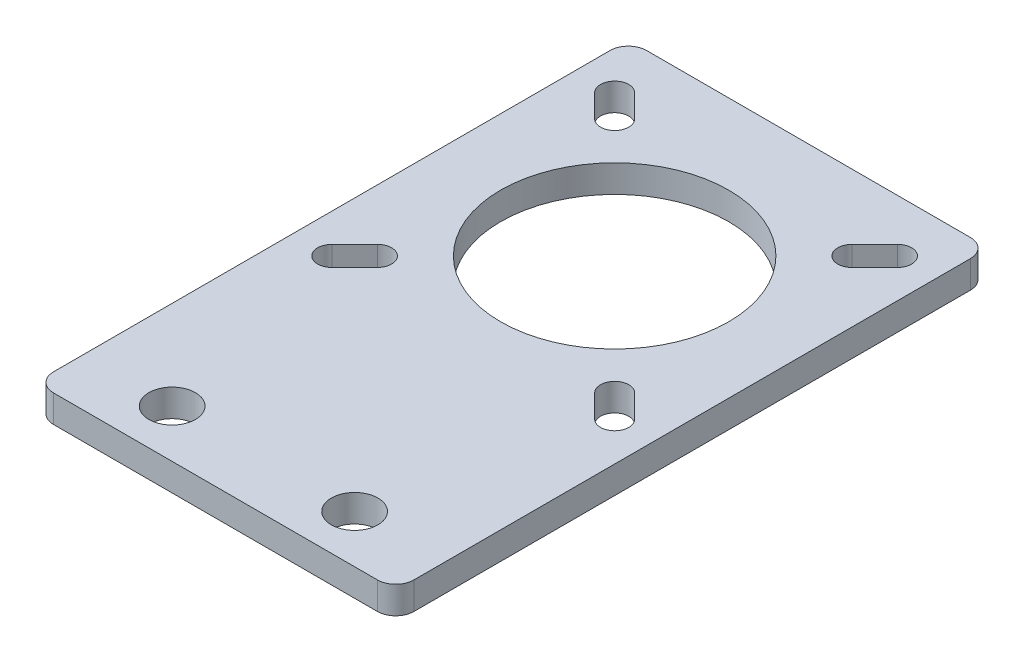
ISO-10303-21;
HEADER;
FILE_DESCRIPTION(('STEP AP214'),'2;1');
FILE_NAME('part.step','',(''),(''),'','','');
FILE_SCHEMA(('AUTOMOTIVE_DESIGN { 1 0 10303 214 1 1 1 1 }'));
ENDSEC;
DATA;
#1=APPLICATION_CONTEXT('core data for automotive mechanical design processes');
#2=APPLICATION_PROTOCOL_DEFINITION('international standard','automotive_design',2000,#1);
#3=PRODUCT_CONTEXT('',#1,'mechanical');
#4=PRODUCT('Part','Part','',(#3));
#5=PRODUCT_RELATED_PRODUCT_CATEGORY('part','',(#4));
#6=PRODUCT_DEFINITION_FORMATION('','',#4);
#7=PRODUCT_DEFINITION_CONTEXT('part definition',#1,'design');
#8=PRODUCT_DEFINITION('design','',#6,#7);
#9=PRODUCT_DEFINITION_SHAPE('','',#8);
#10=(LENGTH_UNIT() NAMED_UNIT(*) SI_UNIT(.MILLI.,.METRE.));
#11=(NAMED_UNIT(*) PLANE_ANGLE_UNIT() SI_UNIT($,.RADIAN.));
#12=(NAMED_UNIT(*) SI_UNIT($,.STERADIAN.) SOLID_ANGLE_UNIT());
#13=UNCERTAINTY_MEASURE_WITH_UNIT(LENGTH_MEASURE(1.E-05),#10,'distance_accuracy_value','');
#14=(GEOMETRIC_REPRESENTATION_CONTEXT(3) GLOBAL_UNCERTAINTY_ASSIGNED_CONTEXT((#13)) GLOBAL_UNIT_ASSIGNED_CONTEXT((#10,
#11,#12)) REPRESENTATION_CONTEXT('',''));
#15=CARTESIAN_POINT('',(0.,0.,0.));
#16=DIRECTION('',(0.,0.,1.));
#17=DIRECTION('',(1.,0.,0.));
#18=AXIS2_PLACEMENT_3D('',#15,#16,#17);
#19=CARTESIAN_POINT('',(-17.75,3.,41.75));
#20=DIRECTION('',(0.,-1.,0.));
#21=DIRECTION('',(0.,0.,-1.));
#22=AXIS2_PLACEMENT_3D('',#19,#20,#21);
#23=PLANE('',#22);
#24=CARTESIAN_POINT('',(-12.9999999999999,3.,13.));
#25=DIRECTION('',(0.,1.,0.));
#26=DIRECTION('',(0.,0.,1.));
#27=AXIS2_PLACEMENT_3D('',#24,#25,#26);
#28=CIRCLE('',#27,1.55);
#29=CARTESIAN_POINT('',(-11.9039844891608,3.,14.0960155108391));
#30=VERTEX_POINT('',#29);
#31=CARTESIAN_POINT('',(-14.0960155108391,3.,11.9039844891609));
#32=VERTEX_POINT('',#31);
#33=EDGE_CURVE('E229',#30,#32,#28,.T.);
#34=ORIENTED_EDGE('',*,*,#33,.F.);
#35=DIRECTION('',(0.707106781186545,0.,-0.70710678118655));
#36=VECTOR('',#35,1.);
#37=CARTESIAN_POINT('',(-11.9039844891608,3.,14.0960155108391));
#38=LINE('',#37,#36);
#39=CARTESIAN_POINT('',(-14.4039844891608,3.,16.5960155108391));
#40=VERTEX_POINT('',#39);
#41=EDGE_CURVE('E237',#40,#30,#38,.T.);
#42=ORIENTED_EDGE('',*,*,#41,.F.);
#43=CARTESIAN_POINT('',(-15.4999999999999,3.,15.5));
#44=DIRECTION('',(0.,1.,0.));
#45=DIRECTION('',(0.,0.,1.));
#46=AXIS2_PLACEMENT_3D('',#43,#44,#45);
#47=CIRCLE('',#46,1.55);
#48=CARTESIAN_POINT('',(-16.5960155108391,3.,14.4039844891608));
#49=VERTEX_POINT('',#48);
#50=EDGE_CURVE('E234',#49,#40,#47,.T.);
#51=ORIENTED_EDGE('',*,*,#50,.F.);
#52=DIRECTION('',(-0.707106781186545,0.,0.70710678118655));
#53=VECTOR('',#52,1.);
#54=CARTESIAN_POINT('',(-14.0960155108391,3.,11.9039844891609));
#55=LINE('',#54,#53);
#56=EDGE_CURVE('E231',#32,#49,#55,.T.);
#57=ORIENTED_EDGE('',*,*,#56,.F.);
#58=EDGE_LOOP('',(#34,#42,#51,#57));
#59=FACE_BOUND('',#58,.T.);
#60=CARTESIAN_POINT('',(-9.99999999999997,3.,38.5));
#61=DIRECTION('',(0.,1.,0.));
#62=DIRECTION('',(0.,0.,1.));
#63=AXIS2_PLACEMENT_3D('',#60,#61,#62);
#64=CIRCLE('',#63,2.55);
#65=CARTESIAN_POINT('',(-9.99999999999997,3.,41.05));
#66=VERTEX_POINT('',#65);
#67=EDGE_CURVE('E291',#66,#66,#64,.T.);
#68=ORIENTED_EDGE('',*,*,#67,.F.);
#69=EDGE_LOOP('',(#68));
#70=FACE_BOUND('',#69,.T.);
#71=CARTESIAN_POINT('',(10.,3.,38.5));
#72=DIRECTION('',(0.,1.,0.));
#73=DIRECTION('',(0.,0.,1.));
#74=AXIS2_PLACEMENT_3D('',#71,#72,#73);
#75=CIRCLE('',#74,2.55);
#76=CARTESIAN_POINT('',(10.,3.,41.05));
#77=VERTEX_POINT('',#76);
#78=EDGE_CURVE('E297',#77,#77,#75,.T.);
#79=ORIENTED_EDGE('',*,*,#78,.F.);
#80=EDGE_LOOP('',(#79));
#81=FACE_BOUND('',#80,.T.);
#82=CARTESIAN_POINT('',(12.9999999999999,3.,-13.));
#83=DIRECTION('',(0.,1.,0.));
#84=DIRECTION('',(0.,0.,1.));
#85=AXIS2_PLACEMENT_3D('',#82,#83,#84);
#86=CIRCLE('',#85,1.55);
#87=CARTESIAN_POINT('',(11.9039844891608,3.,-14.0960155108391));
#88=VERTEX_POINT('',#87);
#89=CARTESIAN_POINT('',(14.0960155108391,3.,-11.9039844891608));
#90=VERTEX_POINT('',#89);
#91=EDGE_CURVE('E303',#88,#90,#86,.T.);
#92=ORIENTED_EDGE('',*,*,#91,.F.);
#93=DIRECTION('',(-0.707106781186545,0.,0.70710678118655));
#94=VECTOR('',#93,1.);
#95=CARTESIAN_POINT('',(11.9039844891608,3.,-14.0960155108391));
#96=LINE('',#95,#94);
#97=CARTESIAN_POINT('',(14.4039844891608,3.,-16.5960155108391));
#98=VERTEX_POINT('',#97);
#99=EDGE_CURVE('E311',#98,#88,#96,.T.);
#100=ORIENTED_EDGE('',*,*,#99,.F.);
#101=CARTESIAN_POINT('',(15.4999999999999,3.,-15.5));
#102=DIRECTION('',(0.,1.,0.));
#103=DIRECTION('',(0.,0.,1.));
#104=AXIS2_PLACEMENT_3D('',#101,#102,#103);
#105=CIRCLE('',#104,1.55);
#106=CARTESIAN_POINT('',(16.5960155108391,3.,-14.4039844891608));
#107=VERTEX_POINT('',#106);
#108=EDGE_CURVE('E308',#107,#98,#105,.T.);
#109=ORIENTED_EDGE('',*,*,#108,.F.);
#110=DIRECTION('',(0.707106781186546,0.,-0.707106781186549));
#111=VECTOR('',#110,1.);
#112=CARTESIAN_POINT('',(14.0960155108391,3.,-11.9039844891608));
#113=LINE('',#112,#111);
#114=EDGE_CURVE('E305',#90,#107,#113,.T.);
#115=ORIENTED_EDGE('',*,*,#114,.F.);
#116=EDGE_LOOP('',(#92,#100,#109,#115));
#117=FACE_BOUND('',#116,.T.);
#118=CARTESIAN_POINT('',(-17.75,3.,41.75));
#119=DIRECTION('',(0.,1.,0.));
#120=DIRECTION('',(0.,0.,-1.));
#121=AXIS2_PLACEMENT_3D('',#118,#119,#120);
#122=CIRCLE('',#121,2.);
#123=CARTESIAN_POINT('',(-19.75,3.,41.75));
#124=VERTEX_POINT('',#123);
#125=CARTESIAN_POINT('',(-17.75,3.,43.75));
#126=VERTEX_POINT('',#125);
#127=EDGE_CURVE('E340',#124,#126,#122,.T.);
#128=ORIENTED_EDGE('',*,*,#127,.T.);
#129=DIRECTION('',(1.,0.,0.));
#130=VECTOR('',#129,1.);
#131=CARTESIAN_POINT('',(17.75,3.,43.75));
#132=LINE('',#131,#130);
#133=CARTESIAN_POINT('',(17.75,3.,43.75));
#134=VERTEX_POINT('',#133);
#135=EDGE_CURVE('E343',#126,#134,#132,.T.);
#136=ORIENTED_EDGE('',*,*,#135,.T.);
#137=CARTESIAN_POINT('',(17.75,3.,41.75));
#138=DIRECTION('',(0.,1.,0.));
#139=DIRECTION('',(0.,0.,1.));
#140=AXIS2_PLACEMENT_3D('',#137,#138,#139);
#141=CIRCLE('',#140,2.);
#142=CARTESIAN_POINT('',(19.75,3.,41.75));
#143=VERTEX_POINT('',#142);
#144=EDGE_CURVE('E346',#134,#143,#141,.T.);
#145=ORIENTED_EDGE('',*,*,#144,.T.);
#146=DIRECTION('',(0.,0.,-1.));
#147=VECTOR('',#146,1.);
#148=CARTESIAN_POINT('',(19.75,3.,41.75));
#149=LINE('',#148,#147);
#150=CARTESIAN_POINT('',(19.75,3.,-19.25));
#151=VERTEX_POINT('',#150);
#152=EDGE_CURVE('E348',#143,#151,#149,.T.);
#153=ORIENTED_EDGE('',*,*,#152,.T.);
#154=CARTESIAN_POINT('',(17.75,3.,-19.25));
#155=DIRECTION('',(0.,1.,0.));
#156=DIRECTION('',(0.,0.,1.));
#157=AXIS2_PLACEMENT_3D('',#154,#155,#156);
#158=CIRCLE('',#157,1.99999999999999);
#159=CARTESIAN_POINT('',(17.75,3.,-21.25));
#160=VERTEX_POINT('',#159);
#161=EDGE_CURVE('E350',#151,#160,#158,.T.);
#162=ORIENTED_EDGE('',*,*,#161,.T.);
#163=DIRECTION('',(-1.,0.,0.));
#164=VECTOR('',#163,1.);
#165=CARTESIAN_POINT('',(17.75,3.,-21.25));
#166=LINE('',#165,#164);
#167=CARTESIAN_POINT('',(-17.75,3.,-21.25));
#168=VERTEX_POINT('',#167);
#169=EDGE_CURVE('E352',#160,#168,#166,.T.);
#170=ORIENTED_EDGE('',*,*,#169,.T.);
#171=CARTESIAN_POINT('',(-17.75,3.,-19.25));
#172=DIRECTION('',(0.,1.,0.));
#173=DIRECTION('',(0.,0.,1.));
#174=AXIS2_PLACEMENT_3D('',#171,#172,#173);
#175=CIRCLE('',#174,1.99999999999999);
#176=CARTESIAN_POINT('',(-19.75,3.,-19.25));
#177=VERTEX_POINT('',#176);
#178=EDGE_CURVE('E354',#168,#177,#175,.T.);
#179=ORIENTED_EDGE('',*,*,#178,.T.);
#180=DIRECTION('',(0.,0.,1.));
#181=VECTOR('',#180,1.);
#182=CARTESIAN_POINT('',(-19.75,3.,41.75));
#183=LINE('',#182,#181);
#184=EDGE_CURVE('E356',#177,#124,#183,.T.);
#185=ORIENTED_EDGE('',*,*,#184,.T.);
#186=EDGE_LOOP('',(#128,#136,#145,#153,#162,#170,#179,#185));
#187=FACE_BOUND('',#186,.T.);
#188=CARTESIAN_POINT('',(0.,3.,0.));
#189=DIRECTION('',(0.,1.,0.));
#190=DIRECTION('',(0.,0.,1.));
#191=AXIS2_PLACEMENT_3D('',#188,#189,#190);
#192=CIRCLE('',#191,12.5);
#193=CARTESIAN_POINT('',(0.,3.,12.5));
#194=VERTEX_POINT('',#193);
#195=EDGE_CURVE('E334',#194,#194,#192,.T.);
#196=ORIENTED_EDGE('',*,*,#195,.F.);
#197=EDGE_LOOP('',(#196));
#198=FACE_BOUND('',#197,.T.);
#199=CARTESIAN_POINT('',(-12.9999999999999,3.,-13.));
#200=DIRECTION('',(0.,1.,0.));
#201=DIRECTION('',(0.,0.,-1.));
#202=AXIS2_PLACEMENT_3D('',#199,#200,#201);
#203=CIRCLE('',#202,1.55);
#204=CARTESIAN_POINT('',(-14.0960155108391,3.,-11.9039844891609));
#205=VERTEX_POINT('',#204);
#206=CARTESIAN_POINT('',(-11.9039844891608,3.,-14.0960155108391));
#207=VERTEX_POINT('',#206);
#208=EDGE_CURVE('E260',#205,#207,#203,.T.);
#209=ORIENTED_EDGE('',*,*,#208,.F.);
#210=DIRECTION('',(0.707106781186545,0.,0.70710678118655));
#211=VECTOR('',#210,1.);
#212=CARTESIAN_POINT('',(-14.0960155108391,3.,-11.9039844891609));
#213=LINE('',#212,#211);
#214=CARTESIAN_POINT('',(-16.5960155108391,3.,-14.4039844891609));
#215=VERTEX_POINT('',#214);
#216=EDGE_CURVE('E268',#215,#205,#213,.T.);
#217=ORIENTED_EDGE('',*,*,#216,.F.);
#218=CARTESIAN_POINT('',(-15.4999999999999,3.,-15.5));
#219=DIRECTION('',(0.,1.,0.));
#220=DIRECTION('',(0.,0.,-1.));
#221=AXIS2_PLACEMENT_3D('',#218,#219,#220);
#222=CIRCLE('',#221,1.55);
#223=CARTESIAN_POINT('',(-14.4039844891608,3.,-16.5960155108391));
#224=VERTEX_POINT('',#223);
#225=EDGE_CURVE('E265',#224,#215,#222,.T.);
#226=ORIENTED_EDGE('',*,*,#225,.F.);
#227=DIRECTION('',(-0.707106781186545,0.,-0.70710678118655));
#228=VECTOR('',#227,1.);
#229=CARTESIAN_POINT('',(-11.9039844891608,3.,-14.0960155108391));
#230=LINE('',#229,#228);
#231=EDGE_CURVE('E262',#207,#224,#230,.T.);
#232=ORIENTED_EDGE('',*,*,#231,.F.);
#233=EDGE_LOOP('',(#209,#217,#226,#232));
#234=FACE_BOUND('',#233,.T.);
#235=CARTESIAN_POINT('',(12.9999999999999,3.,13.));
#236=DIRECTION('',(0.,1.,0.));
#237=DIRECTION('',(0.,0.,-1.));
#238=AXIS2_PLACEMENT_3D('',#235,#236,#237);
#239=CIRCLE('',#238,1.55);
#240=CARTESIAN_POINT('',(14.0960155108391,3.,11.9039844891608));
#241=VERTEX_POINT('',#240);
#242=CARTESIAN_POINT('',(11.9039844891608,3.,14.0960155108391));
#243=VERTEX_POINT('',#242);
#244=EDGE_CURVE('E193',#241,#243,#239,.T.);
#245=ORIENTED_EDGE('',*,*,#244,.F.);
#246=DIRECTION('',(-0.707106781186546,0.,-0.707106781186549));
#247=VECTOR('',#246,1.);
#248=CARTESIAN_POINT('',(14.0960155108391,3.,11.9039844891608));
#249=LINE('',#248,#247);
#250=CARTESIAN_POINT('',(16.5960155108391,3.,14.4039844891608));
#251=VERTEX_POINT('',#250);
#252=EDGE_CURVE('E215',#251,#241,#249,.T.);
#253=ORIENTED_EDGE('',*,*,#252,.F.);
#254=CARTESIAN_POINT('',(15.4999999999999,3.,15.5));
#255=DIRECTION('',(0.,1.,0.));
#256=DIRECTION('',(0.,0.,-1.));
#257=AXIS2_PLACEMENT_3D('',#254,#255,#256);
#258=CIRCLE('',#257,1.55);
#259=CARTESIAN_POINT('',(14.4039844891608,3.,16.5960155108391));
#260=VERTEX_POINT('',#259);
#261=EDGE_CURVE('E213',#260,#251,#258,.T.);
#262=ORIENTED_EDGE('',*,*,#261,.F.);
#263=DIRECTION('',(0.707106781186545,0.,0.70710678118655));
#264=VECTOR('',#263,1.);
#265=CARTESIAN_POINT('',(11.9039844891608,3.,14.0960155108391));
#266=LINE('',#265,#264);
#267=EDGE_CURVE('E201',#243,#260,#266,.T.);
#268=ORIENTED_EDGE('',*,*,#267,.F.);
#269=EDGE_LOOP('',(#245,#253,#262,#268));
#270=FACE_BOUND('',#269,.T.);
#271=ADVANCED_FACE('F32',(#59,#70,#81,#117,#187,#198,#234,#270),#23,.F.);
#272=CARTESIAN_POINT('',(-17.75,0.,41.75));
#273=DIRECTION('',(0.,-1.,0.));
#274=DIRECTION('',(0.,0.,-1.));
#275=AXIS2_PLACEMENT_3D('',#272,#273,#274);
#276=PLANE('',#275);
#277=CARTESIAN_POINT('',(10.,0.,38.5));
#278=DIRECTION('',(0.,1.,0.));
#279=DIRECTION('',(0.,0.,1.));
#280=AXIS2_PLACEMENT_3D('',#277,#278,#279);
#281=CIRCLE('',#280,2.55);
#282=CARTESIAN_POINT('',(10.,0.,41.05));
#283=VERTEX_POINT('',#282);
#284=EDGE_CURVE('E294',#283,#283,#281,.T.);
#285=ORIENTED_EDGE('',*,*,#284,.T.);
#286=EDGE_LOOP('',(#285));
#287=FACE_BOUND('',#286,.T.);
#288=CARTESIAN_POINT('',(-17.75,0.,41.75));
#289=DIRECTION('',(0.,1.,0.));
#290=DIRECTION('',(0.,0.,-1.));
#291=AXIS2_PLACEMENT_3D('',#288,#289,#290);
#292=CIRCLE('',#291,2.);
#293=CARTESIAN_POINT('',(-19.75,0.,41.75));
#294=VERTEX_POINT('',#293);
#295=CARTESIAN_POINT('',(-17.75,0.,43.75));
#296=VERTEX_POINT('',#295);
#297=EDGE_CURVE('E337',#294,#296,#292,.T.);
#298=ORIENTED_EDGE('',*,*,#297,.F.);
#299=DIRECTION('',(0.,0.,1.));
#300=VECTOR('',#299,1.);
#301=CARTESIAN_POINT('',(-19.75,0.,41.75));
#302=LINE('',#301,#300);
#303=CARTESIAN_POINT('',(-19.75,0.,-19.25));
#304=VERTEX_POINT('',#303);
#305=EDGE_CURVE('E344',#304,#294,#302,.T.);
#306=ORIENTED_EDGE('',*,*,#305,.F.);
#307=CARTESIAN_POINT('',(-17.75,0.,-19.25));
#308=DIRECTION('',(0.,1.,0.));
#309=DIRECTION('',(0.,0.,1.));
#310=AXIS2_PLACEMENT_3D('',#307,#308,#309);
#311=CIRCLE('',#310,1.99999999999999);
#312=CARTESIAN_POINT('',(-17.75,0.,-21.25));
#313=VERTEX_POINT('',#312);
#314=EDGE_CURVE('E371',#313,#304,#311,.T.);
#315=ORIENTED_EDGE('',*,*,#314,.F.);
#316=DIRECTION('',(-1.,0.,0.));
#317=VECTOR('',#316,1.);
#318=CARTESIAN_POINT('',(17.75,0.,-21.25));
#319=LINE('',#318,#317);
#320=CARTESIAN_POINT('',(17.75,0.,-21.25));
#321=VERTEX_POINT('',#320);
#322=EDGE_CURVE('E369',#321,#313,#319,.T.);
#323=ORIENTED_EDGE('',*,*,#322,.F.);
#324=CARTESIAN_POINT('',(17.75,0.,-19.25));
#325=DIRECTION('',(0.,1.,0.));
#326=DIRECTION('',(0.,0.,1.));
#327=AXIS2_PLACEMENT_3D('',#324,#325,#326);
#328=CIRCLE('',#327,1.99999999999999);
#329=CARTESIAN_POINT('',(19.75,0.,-19.25));
#330=VERTEX_POINT('',#329);
#331=EDGE_CURVE('E367',#330,#321,#328,.T.);
#332=ORIENTED_EDGE('',*,*,#331,.F.);
#333=DIRECTION('',(0.,0.,-1.));
#334=VECTOR('',#333,1.);
#335=CARTESIAN_POINT('',(19.75,0.,41.75));
#336=LINE('',#335,#334);
#337=CARTESIAN_POINT('',(19.75,0.,41.75));
#338=VERTEX_POINT('',#337);
#339=EDGE_CURVE('E365',#338,#330,#336,.T.);
#340=ORIENTED_EDGE('',*,*,#339,.F.);
#341=CARTESIAN_POINT('',(17.75,0.,41.75));
#342=DIRECTION('',(0.,1.,0.));
#343=DIRECTION('',(0.,0.,1.));
#344=AXIS2_PLACEMENT_3D('',#341,#342,#343);
#345=CIRCLE('',#344,2.);
#346=CARTESIAN_POINT('',(17.75,0.,43.75));
#347=VERTEX_POINT('',#346);
#348=EDGE_CURVE('E363',#347,#338,#345,.T.);
#349=ORIENTED_EDGE('',*,*,#348,.F.);
#350=DIRECTION('',(1.,0.,0.));
#351=VECTOR('',#350,1.);
#352=CARTESIAN_POINT('',(17.75,0.,43.75));
#353=LINE('',#352,#351);
#354=EDGE_CURVE('E361',#296,#347,#353,.T.);
#355=ORIENTED_EDGE('',*,*,#354,.F.);
#356=EDGE_LOOP('',(#298,#306,#315,#323,#332,#340,#349,#355));
#357=FACE_BOUND('',#356,.T.);
#358=CARTESIAN_POINT('',(0.,0.,0.));
#359=DIRECTION('',(0.,1.,0.));
#360=DIRECTION('',(0.,0.,1.));
#361=AXIS2_PLACEMENT_3D('',#358,#359,#360);
#362=CIRCLE('',#361,12.5);
#363=CARTESIAN_POINT('',(0.,0.,12.5));
#364=VERTEX_POINT('',#363);
#365=EDGE_CURVE('E333',#364,#364,#362,.T.);
#366=ORIENTED_EDGE('',*,*,#365,.T.);
#367=EDGE_LOOP('',(#366));
#368=FACE_BOUND('',#367,.T.);
#369=DIRECTION('',(-0.707106781186545,0.,0.70710678118655));
#370=VECTOR('',#369,1.);
#371=CARTESIAN_POINT('',(11.9039844891608,0.,-14.0960155108391));
#372=LINE('',#371,#370);
#373=CARTESIAN_POINT('',(14.4039844891608,0.,-16.5960155108391));
#374=VERTEX_POINT('',#373);
#375=CARTESIAN_POINT('',(11.9039844891608,0.,-14.0960155108391));
#376=VERTEX_POINT('',#375);
#377=EDGE_CURVE('E306',#374,#376,#372,.T.);
#378=ORIENTED_EDGE('',*,*,#377,.T.);
#379=CARTESIAN_POINT('',(12.9999999999999,0.,-13.));
#380=DIRECTION('',(0.,1.,0.));
#381=DIRECTION('',(0.,0.,1.));
#382=AXIS2_PLACEMENT_3D('',#379,#380,#381);
#383=CIRCLE('',#382,1.55);
#384=CARTESIAN_POINT('',(14.0960155108391,0.,-11.9039844891608));
#385=VERTEX_POINT('',#384);
#386=EDGE_CURVE('E300',#376,#385,#383,.T.);
#387=ORIENTED_EDGE('',*,*,#386,.T.);
#388=DIRECTION('',(0.707106781186546,0.,-0.707106781186549));
#389=VECTOR('',#388,1.);
#390=CARTESIAN_POINT('',(14.0960155108391,0.,-11.9039844891608));
#391=LINE('',#390,#389);
#392=CARTESIAN_POINT('',(16.5960155108391,0.,-14.4039844891608));
#393=VERTEX_POINT('',#392);
#394=EDGE_CURVE('E316',#385,#393,#391,.T.);
#395=ORIENTED_EDGE('',*,*,#394,.T.);
#396=CARTESIAN_POINT('',(15.4999999999999,0.,-15.5));
#397=DIRECTION('',(0.,1.,0.));
#398=DIRECTION('',(0.,0.,1.));
#399=AXIS2_PLACEMENT_3D('',#396,#397,#398);
#400=CIRCLE('',#399,1.55);
#401=EDGE_CURVE('E319',#393,#374,#400,.T.);
#402=ORIENTED_EDGE('',*,*,#401,.T.);
#403=EDGE_LOOP('',(#378,#387,#395,#402));
#404=FACE_BOUND('',#403,.T.);
#405=CARTESIAN_POINT('',(-9.99999999999997,0.,38.5));
#406=DIRECTION('',(0.,1.,0.));
#407=DIRECTION('',(0.,0.,1.));
#408=AXIS2_PLACEMENT_3D('',#405,#406,#407);
#409=CIRCLE('',#408,2.55);
#410=CARTESIAN_POINT('',(-9.99999999999997,0.,41.05));
#411=VERTEX_POINT('',#410);
#412=EDGE_CURVE('E290',#411,#411,#409,.T.);
#413=ORIENTED_EDGE('',*,*,#412,.T.);
#414=EDGE_LOOP('',(#413));
#415=FACE_BOUND('',#414,.T.);
#416=DIRECTION('',(0.707106781186545,0.,0.70710678118655));
#417=VECTOR('',#416,1.);
#418=CARTESIAN_POINT('',(-14.0960155108391,0.,-11.9039844891609));
#419=LINE('',#418,#417);
#420=CARTESIAN_POINT('',(-16.5960155108391,0.,-14.4039844891608));
#421=VERTEX_POINT('',#420);
#422=CARTESIAN_POINT('',(-14.0960155108391,0.,-11.9039844891609));
#423=VERTEX_POINT('',#422);
#424=EDGE_CURVE('E263',#421,#423,#419,.T.);
#425=ORIENTED_EDGE('',*,*,#424,.T.);
#426=CARTESIAN_POINT('',(-12.9999999999999,0.,-13.));
#427=DIRECTION('',(0.,1.,0.));
#428=DIRECTION('',(0.,0.,-1.));
#429=AXIS2_PLACEMENT_3D('',#426,#427,#428);
#430=CIRCLE('',#429,1.55);
#431=CARTESIAN_POINT('',(-11.9039844891608,0.,-14.0960155108391));
#432=VERTEX_POINT('',#431);
#433=EDGE_CURVE('E259',#423,#432,#430,.T.);
#434=ORIENTED_EDGE('',*,*,#433,.T.);
#435=DIRECTION('',(-0.707106781186545,0.,-0.70710678118655));
#436=VECTOR('',#435,1.);
#437=CARTESIAN_POINT('',(-11.9039844891608,0.,-14.0960155108391));
#438=LINE('',#437,#436);
#439=CARTESIAN_POINT('',(-14.4039844891608,0.,-16.5960155108391));
#440=VERTEX_POINT('',#439);
#441=EDGE_CURVE('E273',#432,#440,#438,.T.);
#442=ORIENTED_EDGE('',*,*,#441,.T.);
#443=CARTESIAN_POINT('',(-15.4999999999999,0.,-15.5));
#444=DIRECTION('',(0.,1.,0.));
#445=DIRECTION('',(0.,0.,-1.));
#446=AXIS2_PLACEMENT_3D('',#443,#444,#445);
#447=CIRCLE('',#446,1.55);
#448=EDGE_CURVE('E276',#440,#421,#447,.T.);
#449=ORIENTED_EDGE('',*,*,#448,.T.);
#450=EDGE_LOOP('',(#425,#434,#442,#449));
#451=FACE_BOUND('',#450,.T.);
#452=DIRECTION('',(0.707106781186545,0.,-0.70710678118655));
#453=VECTOR('',#452,1.);
#454=CARTESIAN_POINT('',(-11.9039844891608,0.,14.0960155108391));
#455=LINE('',#454,#453);
#456=CARTESIAN_POINT('',(-14.4039844891608,0.,16.5960155108391));
#457=VERTEX_POINT('',#456);
#458=CARTESIAN_POINT('',(-11.9039844891608,0.,14.0960155108391));
#459=VERTEX_POINT('',#458);
#460=EDGE_CURVE('E232',#457,#459,#455,.T.);
#461=ORIENTED_EDGE('',*,*,#460,.T.);
#462=CARTESIAN_POINT('',(-12.9999999999999,0.,13.));
#463=DIRECTION('',(0.,1.,0.));
#464=DIRECTION('',(0.,0.,1.));
#465=AXIS2_PLACEMENT_3D('',#462,#463,#464);
#466=CIRCLE('',#465,1.55);
#467=CARTESIAN_POINT('',(-14.0960155108391,0.,11.9039844891609));
#468=VERTEX_POINT('',#467);
#469=EDGE_CURVE('E209',#459,#468,#466,.T.);
#470=ORIENTED_EDGE('',*,*,#469,.T.);
#471=DIRECTION('',(-0.707106781186545,0.,0.70710678118655));
#472=VECTOR('',#471,1.);
#473=CARTESIAN_POINT('',(-14.0960155108391,0.,11.9039844891609));
#474=LINE('',#473,#472);
#475=CARTESIAN_POINT('',(-16.5960155108391,0.,14.4039844891608));
#476=VERTEX_POINT('',#475);
#477=EDGE_CURVE('E242',#468,#476,#474,.T.);
#478=ORIENTED_EDGE('',*,*,#477,.T.);
#479=CARTESIAN_POINT('',(-15.4999999999999,0.,15.5));
#480=DIRECTION('',(0.,1.,0.));
#481=DIRECTION('',(0.,0.,1.));
#482=AXIS2_PLACEMENT_3D('',#479,#480,#481);
#483=CIRCLE('',#482,1.55);
#484=EDGE_CURVE('E245',#476,#457,#483,.T.);
#485=ORIENTED_EDGE('',*,*,#484,.T.);
#486=EDGE_LOOP('',(#461,#470,#478,#485));
#487=FACE_BOUND('',#486,.T.);
#488=DIRECTION('',(-0.707106781186546,0.,-0.707106781186549));
#489=VECTOR('',#488,1.);
#490=CARTESIAN_POINT('',(14.0960155108391,0.,11.9039844891608));
#491=LINE('',#490,#489);
#492=CARTESIAN_POINT('',(16.5960155108391,0.,14.4039844891608));
#493=VERTEX_POINT('',#492);
#494=CARTESIAN_POINT('',(14.0960155108391,0.,11.9039844891609));
#495=VERTEX_POINT('',#494);
#496=EDGE_CURVE('E202',#493,#495,#491,.T.);
#497=ORIENTED_EDGE('',*,*,#496,.T.);
#498=CARTESIAN_POINT('',(12.9999999999999,0.,13.));
#499=DIRECTION('',(0.,1.,0.));
#500=DIRECTION('',(0.,0.,-1.));
#501=AXIS2_PLACEMENT_3D('',#498,#499,#500);
#502=CIRCLE('',#501,1.55);
#503=CARTESIAN_POINT('',(11.9039844891608,0.,14.0960155108391));
#504=VERTEX_POINT('',#503);
#505=EDGE_CURVE('E55',#495,#504,#502,.T.);
#506=ORIENTED_EDGE('',*,*,#505,.T.);
#507=DIRECTION('',(0.707106781186545,0.,0.70710678118655));
#508=VECTOR('',#507,1.);
#509=CARTESIAN_POINT('',(11.9039844891608,0.,14.0960155108391));
#510=LINE('',#509,#508);
#511=CARTESIAN_POINT('',(14.4039844891608,0.,16.5960155108391));
#512=VERTEX_POINT('',#511);
#513=EDGE_CURVE('E208',#504,#512,#510,.T.);
#514=ORIENTED_EDGE('',*,*,#513,.T.);
#515=CARTESIAN_POINT('',(15.4999999999999,0.,15.5));
#516=DIRECTION('',(0.,1.,0.));
#517=DIRECTION('',(0.,0.,-1.));
#518=AXIS2_PLACEMENT_3D('',#515,#516,#517);
#519=CIRCLE('',#518,1.55);
#520=EDGE_CURVE('E221',#512,#493,#519,.T.);
#521=ORIENTED_EDGE('',*,*,#520,.T.);
#522=EDGE_LOOP('',(#497,#506,#514,#521));
#523=FACE_BOUND('',#522,.T.);
#524=ADVANCED_FACE('F401',(#287,#357,#368,#404,#415,#451,#487,#523),#276,.T.);
#525=CARTESIAN_POINT('',(-17.75,3.,41.75));
#526=DIRECTION('',(0.,-1.,0.));
#527=DIRECTION('',(0.,0.,-1.));
#528=AXIS2_PLACEMENT_3D('',#525,#526,#527);
#529=CYLINDRICAL_SURFACE('',#528,2.);
#530=ORIENTED_EDGE('',*,*,#297,.T.);
#531=DIRECTION('',(0.,-1.,0.));
#532=VECTOR('',#531,1.);
#533=CARTESIAN_POINT('',(-17.75,3.,43.75));
#534=LINE('',#533,#532);
#535=EDGE_CURVE('E11',#126,#296,#534,.T.);
#536=ORIENTED_EDGE('',*,*,#535,.F.);
#537=ORIENTED_EDGE('',*,*,#127,.F.);
#538=DIRECTION('',(0.,-1.,0.));
#539=VECTOR('',#538,1.);
#540=CARTESIAN_POINT('',(-19.75,3.,41.75));
#541=LINE('',#540,#539);
#542=EDGE_CURVE('E358',#124,#294,#541,.T.);
#543=ORIENTED_EDGE('',*,*,#542,.T.);
#544=EDGE_LOOP('',(#530,#536,#537,#543));
#545=FACE_BOUND('',#544,.T.);
#546=ADVANCED_FACE('F34',(#545),#529,.T.);
#547=CARTESIAN_POINT('',(17.75,3.,43.75));
#548=DIRECTION('',(0.,0.,-1.));
#549=DIRECTION('',(-1.,0.,0.));
#550=AXIS2_PLACEMENT_3D('',#547,#548,#549);
#551=PLANE('',#550);
#552=ORIENTED_EDGE('',*,*,#354,.T.);
#553=DIRECTION('',(0.,-1.,0.));
#554=VECTOR('',#553,1.);
#555=CARTESIAN_POINT('',(17.75,3.,43.75));
#556=LINE('',#555,#554);
#557=EDGE_CURVE('E40',#134,#347,#556,.T.);
#558=ORIENTED_EDGE('',*,*,#557,.F.);
#559=ORIENTED_EDGE('',*,*,#135,.F.);
#560=ORIENTED_EDGE('',*,*,#535,.T.);
#561=EDGE_LOOP('',(#552,#558,#559,#560));
#562=FACE_BOUND('',#561,.T.);
#563=ADVANCED_FACE('F419',(#562),#551,.F.);
#564=CARTESIAN_POINT('',(17.75,3.,41.75));
#565=DIRECTION('',(0.,-1.,0.));
#566=DIRECTION('',(0.,0.,-1.));
#567=AXIS2_PLACEMENT_3D('',#564,#565,#566);
#568=CYLINDRICAL_SURFACE('',#567,2.);
#569=ORIENTED_EDGE('',*,*,#348,.T.);
#570=DIRECTION('',(0.,-1.,0.));
#571=VECTOR('',#570,1.);
#572=CARTESIAN_POINT('',(19.75,3.,41.75));
#573=LINE('',#572,#571);
#574=EDGE_CURVE('E388',#143,#338,#573,.T.);
#575=ORIENTED_EDGE('',*,*,#574,.F.);
#576=ORIENTED_EDGE('',*,*,#144,.F.);
#577=ORIENTED_EDGE('',*,*,#557,.T.);
#578=EDGE_LOOP('',(#569,#575,#576,#577));
#579=FACE_BOUND('',#578,.T.);
#580=ADVANCED_FACE('F395',(#579),#568,.T.);
#581=CARTESIAN_POINT('',(19.75,3.,41.75));
#582=DIRECTION('',(-1.,0.,0.));
#583=DIRECTION('',(0.,0.,1.));
#584=AXIS2_PLACEMENT_3D('',#581,#582,#583);
#585=PLANE('',#584);
#586=ORIENTED_EDGE('',*,*,#339,.T.);
#587=DIRECTION('',(0.,-1.,0.));
#588=VECTOR('',#587,1.);
#589=CARTESIAN_POINT('',(19.75,3.,-19.25));
#590=LINE('',#589,#588);
#591=EDGE_CURVE('E385',#151,#330,#590,.T.);
#592=ORIENTED_EDGE('',*,*,#591,.F.);
#593=ORIENTED_EDGE('',*,*,#152,.F.);
#594=ORIENTED_EDGE('',*,*,#574,.T.);
#595=EDGE_LOOP('',(#586,#592,#593,#594));
#596=FACE_BOUND('',#595,.T.);
#597=ADVANCED_FACE('F407',(#596),#585,.F.);
#598=CARTESIAN_POINT('',(17.75,3.,-19.25));
#599=DIRECTION('',(0.,-1.,0.));
#600=DIRECTION('',(0.,0.,-1.));
#601=AXIS2_PLACEMENT_3D('',#598,#599,#600);
#602=CYLINDRICAL_SURFACE('',#601,1.99999999999999);
#603=ORIENTED_EDGE('',*,*,#331,.T.);
#604=DIRECTION('',(0.,-1.,0.));
#605=VECTOR('',#604,1.);
#606=CARTESIAN_POINT('',(17.75,3.,-21.25));
#607=LINE('',#606,#605);
#608=EDGE_CURVE('E382',#160,#321,#607,.T.);
#609=ORIENTED_EDGE('',*,*,#608,.F.);
#610=ORIENTED_EDGE('',*,*,#161,.F.);
#611=ORIENTED_EDGE('',*,*,#591,.T.);
#612=EDGE_LOOP('',(#603,#609,#610,#611));
#613=FACE_BOUND('',#612,.T.);
#614=ADVANCED_FACE('F411',(#613),#602,.T.);
#615=CARTESIAN_POINT('',(17.75,3.,-21.25));
#616=DIRECTION('',(0.,0.,1.));
#617=DIRECTION('',(1.,0.,0.));
#618=AXIS2_PLACEMENT_3D('',#615,#616,#617);
#619=PLANE('',#618);
#620=ORIENTED_EDGE('',*,*,#322,.T.);
#621=DIRECTION('',(0.,-1.,0.));
#622=VECTOR('',#621,1.);
#623=CARTESIAN_POINT('',(-17.75,3.,-21.25));
#624=LINE('',#623,#622);
#625=EDGE_CURVE('E379',#168,#313,#624,.T.);
#626=ORIENTED_EDGE('',*,*,#625,.F.);
#627=ORIENTED_EDGE('',*,*,#169,.F.);
#628=ORIENTED_EDGE('',*,*,#608,.T.);
#629=EDGE_LOOP('',(#620,#626,#627,#628));
#630=FACE_BOUND('',#629,.T.);
#631=ADVANCED_FACE('F432',(#630),#619,.F.);
#632=CARTESIAN_POINT('',(-17.75,3.,-19.25));
#633=DIRECTION('',(0.,-1.,0.));
#634=DIRECTION('',(0.,0.,-1.));
#635=AXIS2_PLACEMENT_3D('',#632,#633,#634);
#636=CYLINDRICAL_SURFACE('',#635,1.99999999999999);
#637=ORIENTED_EDGE('',*,*,#314,.T.);
#638=DIRECTION('',(0.,-1.,0.));
#639=VECTOR('',#638,1.);
#640=CARTESIAN_POINT('',(-19.75,3.,-19.25));
#641=LINE('',#640,#639);
#642=EDGE_CURVE('E376',#177,#304,#641,.T.);
#643=ORIENTED_EDGE('',*,*,#642,.F.);
#644=ORIENTED_EDGE('',*,*,#178,.F.);
#645=ORIENTED_EDGE('',*,*,#625,.T.);
#646=EDGE_LOOP('',(#637,#643,#644,#645));
#647=FACE_BOUND('',#646,.T.);
#648=ADVANCED_FACE('F430',(#647),#636,.T.);
#649=CARTESIAN_POINT('',(-19.75,3.,41.75));
#650=DIRECTION('',(1.,0.,0.));
#651=DIRECTION('',(0.,0.,-1.));
#652=AXIS2_PLACEMENT_3D('',#649,#650,#651);
#653=PLANE('',#652);
#654=ORIENTED_EDGE('',*,*,#305,.T.);
#655=ORIENTED_EDGE('',*,*,#542,.F.);
#656=ORIENTED_EDGE('',*,*,#184,.F.);
#657=ORIENTED_EDGE('',*,*,#642,.T.);
#658=EDGE_LOOP('',(#654,#655,#656,#657));
#659=FACE_BOUND('',#658,.T.);
#660=ADVANCED_FACE('F425',(#659),#653,.F.);
#661=CARTESIAN_POINT('',(0.,3.,0.));
#662=DIRECTION('',(0.,-1.,0.));
#663=DIRECTION('',(0.,0.,-1.));
#664=AXIS2_PLACEMENT_3D('',#661,#662,#663);
#665=CYLINDRICAL_SURFACE('',#664,12.5);
#666=ORIENTED_EDGE('',*,*,#195,.T.);
#667=EDGE_LOOP('',(#666));
#668=FACE_BOUND('',#667,.T.);
#669=ORIENTED_EDGE('',*,*,#365,.F.);
#670=EDGE_LOOP('',(#669));
#671=FACE_BOUND('',#670,.T.);
#672=ADVANCED_FACE('F452',(#668,#671),#665,.F.);
#673=CARTESIAN_POINT('',(12.9999999999999,3.,-13.));
#674=DIRECTION('',(0.,-1.,0.));
#675=DIRECTION('',(0.,0.,-1.));
#676=AXIS2_PLACEMENT_3D('',#673,#674,#675);
#677=CYLINDRICAL_SURFACE('',#676,1.55);
#678=ORIENTED_EDGE('',*,*,#386,.F.);
#679=DIRECTION('',(0.,-1.,0.));
#680=VECTOR('',#679,1.);
#681=CARTESIAN_POINT('',(11.9039844891608,3.,-14.0960155108391));
#682=LINE('',#681,#680);
#683=EDGE_CURVE('E313',#88,#376,#682,.T.);
#684=ORIENTED_EDGE('',*,*,#683,.F.);
#685=ORIENTED_EDGE('',*,*,#91,.T.);
#686=DIRECTION('',(0.,-1.,0.));
#687=VECTOR('',#686,1.);
#688=CARTESIAN_POINT('',(14.0960155108391,3.,-11.9039844891608));
#689=LINE('',#688,#687);
#690=EDGE_CURVE('E330',#90,#385,#689,.T.);
#691=ORIENTED_EDGE('',*,*,#690,.T.);
#692=EDGE_LOOP('',(#678,#684,#685,#691));
#693=FACE_BOUND('',#692,.T.);
#694=ADVANCED_FACE('F459',(#693),#677,.F.);
#695=CARTESIAN_POINT('',(14.0960155108391,3.,-11.9039844891608));
#696=DIRECTION('',(-0.707106781186549,0.,-0.707106781186546));
#697=DIRECTION('',(-0.707106781186546,0.,0.707106781186549));
#698=AXIS2_PLACEMENT_3D('',#695,#696,#697);
#699=PLANE('',#698);
#700=ORIENTED_EDGE('',*,*,#394,.F.);
#701=ORIENTED_EDGE('',*,*,#690,.F.);
#702=ORIENTED_EDGE('',*,*,#114,.T.);
#703=DIRECTION('',(0.,-1.,0.));
#704=VECTOR('',#703,1.);
#705=CARTESIAN_POINT('',(16.5960155108391,3.,-14.4039844891608));
#706=LINE('',#705,#704);
#707=EDGE_CURVE('E328',#107,#393,#706,.T.);
#708=ORIENTED_EDGE('',*,*,#707,.T.);
#709=EDGE_LOOP('',(#700,#701,#702,#708));
#710=FACE_BOUND('',#709,.T.);
#711=ADVANCED_FACE('F464',(#710),#699,.T.);
#712=CARTESIAN_POINT('',(15.4999999999999,3.,-15.5));
#713=DIRECTION('',(0.,-1.,0.));
#714=DIRECTION('',(0.,0.,-1.));
#715=AXIS2_PLACEMENT_3D('',#712,#713,#714);
#716=CYLINDRICAL_SURFACE('',#715,1.55);
#717=ORIENTED_EDGE('',*,*,#401,.F.);
#718=ORIENTED_EDGE('',*,*,#707,.F.);
#719=ORIENTED_EDGE('',*,*,#108,.T.);
#720=DIRECTION('',(0.,-1.,0.));
#721=VECTOR('',#720,1.);
#722=CARTESIAN_POINT('',(14.4039844891608,3.,-16.5960155108391));
#723=LINE('',#722,#721);
#724=EDGE_CURVE('E326',#98,#374,#723,.T.);
#725=ORIENTED_EDGE('',*,*,#724,.T.);
#726=EDGE_LOOP('',(#717,#718,#719,#725));
#727=FACE_BOUND('',#726,.T.);
#728=ADVANCED_FACE('F536',(#727),#716,.F.);
#729=CARTESIAN_POINT('',(11.9039844891608,3.,-14.0960155108391));
#730=DIRECTION('',(0.70710678118655,0.,0.707106781186545));
#731=DIRECTION('',(0.707106781186545,0.,-0.70710678118655));
#732=AXIS2_PLACEMENT_3D('',#729,#730,#731);
#733=PLANE('',#732);
#734=ORIENTED_EDGE('',*,*,#377,.F.);
#735=ORIENTED_EDGE('',*,*,#724,.F.);
#736=ORIENTED_EDGE('',*,*,#99,.T.);
#737=ORIENTED_EDGE('',*,*,#683,.T.);
#738=EDGE_LOOP('',(#734,#735,#736,#737));
#739=FACE_BOUND('',#738,.T.);
#740=ADVANCED_FACE('F532',(#739),#733,.T.);
#741=CARTESIAN_POINT('',(10.,3.,38.5));
#742=DIRECTION('',(0.,-1.,0.));
#743=DIRECTION('',(0.,0.,-1.));
#744=AXIS2_PLACEMENT_3D('',#741,#742,#743);
#745=CYLINDRICAL_SURFACE('',#744,2.55);
#746=ORIENTED_EDGE('',*,*,#78,.T.);
#747=EDGE_LOOP('',(#746));
#748=FACE_BOUND('',#747,.T.);
#749=ORIENTED_EDGE('',*,*,#284,.F.);
#750=EDGE_LOOP('',(#749));
#751=FACE_BOUND('',#750,.T.);
#752=ADVANCED_FACE('F528',(#748,#751),#745,.F.);
#753=CARTESIAN_POINT('',(-9.99999999999997,3.,38.5));
#754=DIRECTION('',(0.,-1.,0.));
#755=DIRECTION('',(0.,0.,-1.));
#756=AXIS2_PLACEMENT_3D('',#753,#754,#755);
#757=CYLINDRICAL_SURFACE('',#756,2.55);
#758=ORIENTED_EDGE('',*,*,#67,.T.);
#759=EDGE_LOOP('',(#758));
#760=FACE_BOUND('',#759,.T.);
#761=ORIENTED_EDGE('',*,*,#412,.F.);
#762=EDGE_LOOP('',(#761));
#763=FACE_BOUND('',#762,.T.);
#764=ADVANCED_FACE('F524',(#760,#763),#757,.F.);
#765=CARTESIAN_POINT('',(-12.9999999999999,3.,-13.));
#766=DIRECTION('',(0.,-1.,0.));
#767=DIRECTION('',(0.,0.,-1.));
#768=AXIS2_PLACEMENT_3D('',#765,#766,#767);
#769=CYLINDRICAL_SURFACE('',#768,1.55);
#770=ORIENTED_EDGE('',*,*,#433,.F.);
#771=DIRECTION('',(0.,-1.,0.));
#772=VECTOR('',#771,1.);
#773=CARTESIAN_POINT('',(-14.0960155108391,3.,-11.9039844891609));
#774=LINE('',#773,#772);
#775=EDGE_CURVE('E270',#205,#423,#774,.T.);
#776=ORIENTED_EDGE('',*,*,#775,.F.);
#777=ORIENTED_EDGE('',*,*,#208,.T.);
#778=DIRECTION('',(0.,-1.,0.));
#779=VECTOR('',#778,1.);
#780=CARTESIAN_POINT('',(-11.9039844891608,3.,-14.0960155108391));
#781=LINE('',#780,#779);
#782=EDGE_CURVE('E287',#207,#432,#781,.T.);
#783=ORIENTED_EDGE('',*,*,#782,.T.);
#784=EDGE_LOOP('',(#770,#776,#777,#783));
#785=FACE_BOUND('',#784,.T.);
#786=ADVANCED_FACE('F520',(#785),#769,.F.);
#787=CARTESIAN_POINT('',(-11.9039844891608,3.,-14.0960155108391));
#788=DIRECTION('',(-0.70710678118655,0.,0.707106781186544));
#789=DIRECTION('',(0.707106781186545,0.,0.70710678118655));
#790=AXIS2_PLACEMENT_3D('',#787,#788,#789);
#791=PLANE('',#790);
#792=ORIENTED_EDGE('',*,*,#441,.F.);
#793=ORIENTED_EDGE('',*,*,#782,.F.);
#794=ORIENTED_EDGE('',*,*,#231,.T.);
#795=DIRECTION('',(0.,-1.,0.));
#796=VECTOR('',#795,1.);
#797=CARTESIAN_POINT('',(-14.4039844891608,3.,-16.5960155108391));
#798=LINE('',#797,#796);
#799=EDGE_CURVE('E285',#224,#440,#798,.T.);
#800=ORIENTED_EDGE('',*,*,#799,.T.);
#801=EDGE_LOOP('',(#792,#793,#794,#800));
#802=FACE_BOUND('',#801,.T.);
#803=ADVANCED_FACE('F516',(#802),#791,.T.);
#804=CARTESIAN_POINT('',(-15.4999999999999,3.,-15.5));
#805=DIRECTION('',(0.,-1.,0.));
#806=DIRECTION('',(0.,0.,-1.));
#807=AXIS2_PLACEMENT_3D('',#804,#805,#806);
#808=CYLINDRICAL_SURFACE('',#807,1.55);
#809=ORIENTED_EDGE('',*,*,#448,.F.);
#810=ORIENTED_EDGE('',*,*,#799,.F.);
#811=ORIENTED_EDGE('',*,*,#225,.T.);
#812=DIRECTION('',(0.,-1.,0.));
#813=VECTOR('',#812,1.);
#814=CARTESIAN_POINT('',(-16.5960155108391,3.,-14.4039844891608));
#815=LINE('',#814,#813);
#816=EDGE_CURVE('E283',#215,#421,#815,.T.);
#817=ORIENTED_EDGE('',*,*,#816,.T.);
#818=EDGE_LOOP('',(#809,#810,#811,#817));
#819=FACE_BOUND('',#818,.T.);
#820=ADVANCED_FACE('F512',(#819),#808,.F.);
#821=CARTESIAN_POINT('',(-14.0960155108391,3.,-11.9039844891609));
#822=DIRECTION('',(0.70710678118655,0.,-0.707106781186545));
#823=DIRECTION('',(-0.707106781186545,0.,-0.70710678118655));
#824=AXIS2_PLACEMENT_3D('',#821,#822,#823);
#825=PLANE('',#824);
#826=ORIENTED_EDGE('',*,*,#424,.F.);
#827=ORIENTED_EDGE('',*,*,#816,.F.);
#828=ORIENTED_EDGE('',*,*,#216,.T.);
#829=ORIENTED_EDGE('',*,*,#775,.T.);
#830=EDGE_LOOP('',(#826,#827,#828,#829));
#831=FACE_BOUND('',#830,.T.);
#832=ADVANCED_FACE('F508',(#831),#825,.T.);
#833=CARTESIAN_POINT('',(-12.9999999999999,3.,13.));
#834=DIRECTION('',(0.,-1.,0.));
#835=DIRECTION('',(0.,0.,-1.));
#836=AXIS2_PLACEMENT_3D('',#833,#834,#835);
#837=CYLINDRICAL_SURFACE('',#836,1.55);
#838=ORIENTED_EDGE('',*,*,#469,.F.);
#839=DIRECTION('',(0.,-1.,0.));
#840=VECTOR('',#839,1.);
#841=CARTESIAN_POINT('',(-11.9039844891608,3.,14.0960155108391));
#842=LINE('',#841,#840);
#843=EDGE_CURVE('E239',#30,#459,#842,.T.);
#844=ORIENTED_EDGE('',*,*,#843,.F.);
#845=ORIENTED_EDGE('',*,*,#33,.T.);
#846=DIRECTION('',(0.,-1.,0.));
#847=VECTOR('',#846,1.);
#848=CARTESIAN_POINT('',(-14.0960155108391,3.,11.9039844891609));
#849=LINE('',#848,#847);
#850=EDGE_CURVE('E256',#32,#468,#849,.T.);
#851=ORIENTED_EDGE('',*,*,#850,.T.);
#852=EDGE_LOOP('',(#838,#844,#845,#851));
#853=FACE_BOUND('',#852,.T.);
#854=ADVANCED_FACE('F504',(#853),#837,.F.);
#855=CARTESIAN_POINT('',(-14.0960155108391,3.,11.9039844891609));
#856=DIRECTION('',(0.70710678118655,0.,0.707106781186545));
#857=DIRECTION('',(0.707106781186545,0.,-0.70710678118655));
#858=AXIS2_PLACEMENT_3D('',#855,#856,#857);
#859=PLANE('',#858);
#860=ORIENTED_EDGE('',*,*,#477,.F.);
#861=ORIENTED_EDGE('',*,*,#850,.F.);
#862=ORIENTED_EDGE('',*,*,#56,.T.);
#863=DIRECTION('',(0.,-1.,0.));
#864=VECTOR('',#863,1.);
#865=CARTESIAN_POINT('',(-16.5960155108391,3.,14.4039844891608));
#866=LINE('',#865,#864);
#867=EDGE_CURVE('E254',#49,#476,#866,.T.);
#868=ORIENTED_EDGE('',*,*,#867,.T.);
#869=EDGE_LOOP('',(#860,#861,#862,#868));
#870=FACE_BOUND('',#869,.T.);
#871=ADVANCED_FACE('F500',(#870),#859,.T.);
#872=CARTESIAN_POINT('',(-15.4999999999999,3.,15.5));
#873=DIRECTION('',(0.,-1.,0.));
#874=DIRECTION('',(0.,0.,-1.));
#875=AXIS2_PLACEMENT_3D('',#872,#873,#874);
#876=CYLINDRICAL_SURFACE('',#875,1.55);
#877=ORIENTED_EDGE('',*,*,#484,.F.);
#878=ORIENTED_EDGE('',*,*,#867,.F.);
#879=ORIENTED_EDGE('',*,*,#50,.T.);
#880=DIRECTION('',(0.,-1.,0.));
#881=VECTOR('',#880,1.);
#882=CARTESIAN_POINT('',(-14.4039844891608,3.,16.5960155108391));
#883=LINE('',#882,#881);
#884=EDGE_CURVE('E252',#40,#457,#883,.T.);
#885=ORIENTED_EDGE('',*,*,#884,.T.);
#886=EDGE_LOOP('',(#877,#878,#879,#885));
#887=FACE_BOUND('',#886,.T.);
#888=ADVANCED_FACE('F496',(#887),#876,.F.);
#889=CARTESIAN_POINT('',(-11.9039844891608,3.,14.0960155108391));
#890=DIRECTION('',(-0.70710678118655,0.,-0.707106781186544));
#891=DIRECTION('',(-0.707106781186545,0.,0.70710678118655));
#892=AXIS2_PLACEMENT_3D('',#889,#890,#891);
#893=PLANE('',#892);
#894=ORIENTED_EDGE('',*,*,#460,.F.);
#895=ORIENTED_EDGE('',*,*,#884,.F.);
#896=ORIENTED_EDGE('',*,*,#41,.T.);
#897=ORIENTED_EDGE('',*,*,#843,.T.);
#898=EDGE_LOOP('',(#894,#895,#896,#897));
#899=FACE_BOUND('',#898,.T.);
#900=ADVANCED_FACE('F493',(#899),#893,.T.);
#901=CARTESIAN_POINT('',(12.9999999999999,3.,13.));
#902=DIRECTION('',(0.,-1.,0.));
#903=DIRECTION('',(0.,0.,-1.));
#904=AXIS2_PLACEMENT_3D('',#901,#902,#903);
#905=CYLINDRICAL_SURFACE('',#904,1.55);
#906=ORIENTED_EDGE('',*,*,#505,.F.);
#907=DIRECTION('',(0.,-1.,0.));
#908=VECTOR('',#907,1.);
#909=CARTESIAN_POINT('',(14.0960155108391,3.,11.9039844891608));
#910=LINE('',#909,#908);
#911=EDGE_CURVE('E197',#241,#495,#910,.T.);
#912=ORIENTED_EDGE('',*,*,#911,.F.);
#913=ORIENTED_EDGE('',*,*,#244,.T.);
#914=DIRECTION('',(0.,-1.,0.));
#915=VECTOR('',#914,1.);
#916=CARTESIAN_POINT('',(11.9039844891608,3.,14.0960155108391));
#917=LINE('',#916,#915);
#918=EDGE_CURVE('E196',#243,#504,#917,.T.);
#919=ORIENTED_EDGE('',*,*,#918,.T.);
#920=EDGE_LOOP('',(#906,#912,#913,#919));
#921=FACE_BOUND('',#920,.T.);
#922=ADVANCED_FACE('F195',(#921),#905,.F.);
#923=CARTESIAN_POINT('',(11.9039844891608,3.,14.0960155108391));
#924=DIRECTION('',(0.70710678118655,0.,-0.707106781186545));
#925=DIRECTION('',(-0.707106781186545,0.,-0.70710678118655));
#926=AXIS2_PLACEMENT_3D('',#923,#924,#925);
#927=PLANE('',#926);
#928=ORIENTED_EDGE('',*,*,#513,.F.);
#929=ORIENTED_EDGE('',*,*,#918,.F.);
#930=ORIENTED_EDGE('',*,*,#267,.T.);
#931=DIRECTION('',(0.,-1.,0.));
#932=VECTOR('',#931,1.);
#933=CARTESIAN_POINT('',(14.4039844891608,3.,16.5960155108391));
#934=LINE('',#933,#932);
#935=EDGE_CURVE('E210',#260,#512,#934,.T.);
#936=ORIENTED_EDGE('',*,*,#935,.T.);
#937=EDGE_LOOP('',(#928,#929,#930,#936));
#938=FACE_BOUND('',#937,.T.);
#939=ADVANCED_FACE('F205',(#938),#927,.T.);
#940=CARTESIAN_POINT('',(15.4999999999999,3.,15.5));
#941=DIRECTION('',(0.,-1.,0.));
#942=DIRECTION('',(0.,0.,-1.));
#943=AXIS2_PLACEMENT_3D('',#940,#941,#942);
#944=CYLINDRICAL_SURFACE('',#943,1.55);
#945=ORIENTED_EDGE('',*,*,#520,.F.);
#946=ORIENTED_EDGE('',*,*,#935,.F.);
#947=ORIENTED_EDGE('',*,*,#261,.T.);
#948=DIRECTION('',(0.,-1.,0.));
#949=VECTOR('',#948,1.);
#950=CARTESIAN_POINT('',(16.5960155108391,3.,14.4039844891608));
#951=LINE('',#950,#949);
#952=EDGE_CURVE('E47',#251,#493,#951,.T.);
#953=ORIENTED_EDGE('',*,*,#952,.T.);
#954=EDGE_LOOP('',(#945,#946,#947,#953));
#955=FACE_BOUND('',#954,.T.);
#956=ADVANCED_FACE('F481',(#955),#944,.F.);
#957=CARTESIAN_POINT('',(14.0960155108391,3.,11.9039844891608));
#958=DIRECTION('',(-0.707106781186549,0.,0.707106781186546));
#959=DIRECTION('',(0.707106781186546,0.,0.707106781186549));
#960=AXIS2_PLACEMENT_3D('',#957,#958,#959);
#961=PLANE('',#960);
#962=ORIENTED_EDGE('',*,*,#496,.F.);
#963=ORIENTED_EDGE('',*,*,#952,.F.);
#964=ORIENTED_EDGE('',*,*,#252,.T.);
#965=ORIENTED_EDGE('',*,*,#911,.T.);
#966=EDGE_LOOP('',(#962,#963,#964,#965));
#967=FACE_BOUND('',#966,.T.);
#968=ADVANCED_FACE('F479',(#967),#961,.T.);
#969=CLOSED_SHELL('',(#271,#524,#546,#563,#580,#597,#614,#631,#648,#660,#672,#694,#711,#728,
#740,#752,#764,#786,#803,#820,#832,#854,#871,#888,#900,#922,#939,#956,#968));
#970=MANIFOLD_SOLID_BREP('B2',#969);
#971=ADVANCED_BREP_SHAPE_REPRESENTATION('',(#18,#970),#14);
#972=SHAPE_DEFINITION_REPRESENTATION(#9,#971);
ENDSEC;
END-ISO-10303-21;
